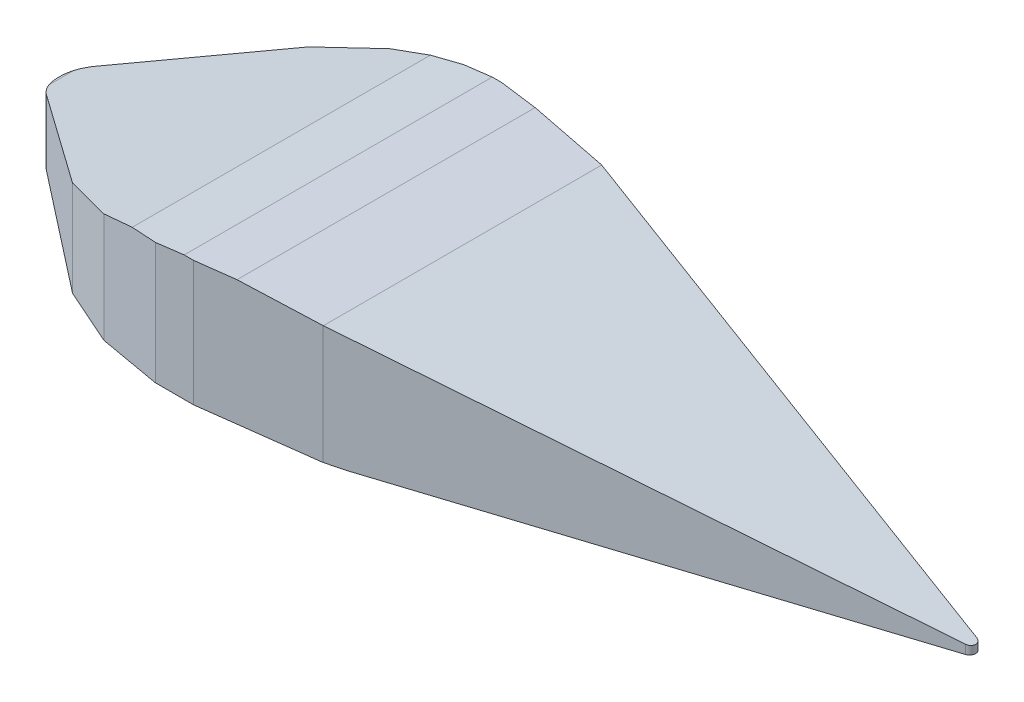
ISO-10303-21;
HEADER;
FILE_DESCRIPTION(('STEP AP214'),'2;1');
FILE_NAME('part.step','',(''),(''),'','','');
FILE_SCHEMA(('AUTOMOTIVE_DESIGN { 1 0 10303 214 1 1 1 1 }'));
ENDSEC;
DATA;
#1=APPLICATION_CONTEXT('core data for automotive mechanical design processes');
#2=APPLICATION_PROTOCOL_DEFINITION('international standard','automotive_design',2000,#1);
#3=PRODUCT_CONTEXT('',#1,'mechanical');
#4=PRODUCT('Part','Part','',(#3));
#5=PRODUCT_RELATED_PRODUCT_CATEGORY('part','',(#4));
#6=PRODUCT_DEFINITION_FORMATION('','',#4);
#7=PRODUCT_DEFINITION_CONTEXT('part definition',#1,'design');
#8=PRODUCT_DEFINITION('design','',#6,#7);
#9=PRODUCT_DEFINITION_SHAPE('','',#8);
#10=(LENGTH_UNIT() NAMED_UNIT(*) SI_UNIT(.MILLI.,.METRE.));
#11=(NAMED_UNIT(*) PLANE_ANGLE_UNIT() SI_UNIT($,.RADIAN.));
#12=(NAMED_UNIT(*) SI_UNIT($,.STERADIAN.) SOLID_ANGLE_UNIT());
#13=UNCERTAINTY_MEASURE_WITH_UNIT(LENGTH_MEASURE(1.E-05),#10,'distance_accuracy_value','');
#14=(GEOMETRIC_REPRESENTATION_CONTEXT(3) GLOBAL_UNCERTAINTY_ASSIGNED_CONTEXT((#13)) GLOBAL_UNIT_ASSIGNED_CONTEXT((#10,
#11,#12)) REPRESENTATION_CONTEXT('',''));
#15=CARTESIAN_POINT('',(0.,0.,0.));
#16=DIRECTION('',(0.,0.,1.));
#17=DIRECTION('',(1.,0.,0.));
#18=AXIS2_PLACEMENT_3D('',#15,#16,#17);
#19=CARTESIAN_POINT('',(1401.451,800.,-800.));
#20=DIRECTION('',(0.,0.,1.));
#21=DIRECTION('',(1.,0.,0.));
#22=AXIS2_PLACEMENT_3D('',#19,#20,#21);
#23=PLANE('',#22);
#24=DIRECTION('',(-0.992522376322293,-0.122062821938327,0.));
#25=VECTOR('',#24,1.);
#26=CARTESIAN_POINT('',(1255.921,763.655,-800.));
#27=LINE('',#26,#25);
#28=CARTESIAN_POINT('',(1551.451,800.,-800.));
#29=VERTEX_POINT('',#28);
#30=CARTESIAN_POINT('',(1401.451,781.55263425033,-800.));
#31=VERTEX_POINT('',#30);
#32=EDGE_CURVE('E472',#29,#31,#27,.T.);
#33=ORIENTED_EDGE('',*,*,#32,.F.);
#34=DIRECTION('',(-1.,0.,0.));
#35=VECTOR('',#34,1.);
#36=CARTESIAN_POINT('',(1401.451,800.,-800.));
#37=LINE('',#36,#35);
#38=CARTESIAN_POINT('',(1600.,800.,-800.));
#39=VERTEX_POINT('',#38);
#40=EDGE_CURVE('E220',#39,#29,#37,.T.);
#41=ORIENTED_EDGE('',*,*,#40,.F.);
#42=DIRECTION('',(0.,-1.,0.));
#43=VECTOR('',#42,1.);
#44=CARTESIAN_POINT('',(1600.,800.,-800.));
#45=LINE('',#44,#43);
#46=CARTESIAN_POINT('',(1600.,150.,-800.));
#47=VERTEX_POINT('',#46);
#48=EDGE_CURVE('E253',#39,#47,#45,.T.);
#49=ORIENTED_EDGE('',*,*,#48,.T.);
#50=DIRECTION('',(1.,0.,0.));
#51=VECTOR('',#50,1.);
#52=CARTESIAN_POINT('',(2301.451,150.,-800.));
#53=LINE('',#52,#51);
#54=CARTESIAN_POINT('',(1401.45099999999,150.,-800.));
#55=VERTEX_POINT('',#54);
#56=EDGE_CURVE('E474',#55,#47,#53,.T.);
#57=ORIENTED_EDGE('',*,*,#56,.F.);
#58=DIRECTION('',(0.,-1.,0.));
#59=VECTOR('',#58,1.);
#60=CARTESIAN_POINT('',(1401.451,800.,-800.));
#61=LINE('',#60,#59);
#62=EDGE_CURVE('E250',#31,#55,#61,.T.);
#63=ORIENTED_EDGE('',*,*,#62,.F.);
#64=EDGE_LOOP('',(#33,#41,#49,#57,#63));
#65=FACE_BOUND('',#64,.T.);
#66=ADVANCED_FACE('F46',(#65),#23,.F.);
#67=CARTESIAN_POINT('',(784.13,800.,-612.54));
#68=DIRECTION('',(0.406737992749078,0.,0.913544856728147));
#69=DIRECTION('',(0.913544856728147,0.,-0.406737992749078));
#70=AXIS2_PLACEMENT_3D('',#67,#68,#69);
#71=PLANE('',#70);
#72=DIRECTION('',(0.913544856728147,0.,-0.406737992749078));
#73=VECTOR('',#72,1.);
#74=CARTESIAN_POINT('',(784.13,150.,-612.54));
#75=LINE('',#74,#73);
#76=CARTESIAN_POINT('',(784.13,150.,-612.54));
#77=VERTEX_POINT('',#76);
#78=CARTESIAN_POINT('',(1076.464,150.,-742.696));
#79=VERTEX_POINT('',#78);
#80=EDGE_CURVE('E407',#77,#79,#75,.T.);
#81=ORIENTED_EDGE('',*,*,#80,.F.);
#82=DIRECTION('',(0.,-1.,0.));
#83=VECTOR('',#82,1.);
#84=CARTESIAN_POINT('',(784.13,800.,-612.54));
#85=LINE('',#84,#83);
#86=CARTESIAN_POINT('',(784.13,645.829431269961,-612.54));
#87=VERTEX_POINT('',#86);
#88=EDGE_CURVE('E295',#87,#77,#85,.T.);
#89=ORIENTED_EDGE('',*,*,#88,.F.);
#90=DIRECTION('',(-0.890658508940707,-0.222433970466134,0.396548293697233));
#91=VECTOR('',#90,1.);
#92=CARTESIAN_POINT('',(814.673148937951,653.457308644519,-626.138740116332));
#93=LINE('',#92,#91);
#94=CARTESIAN_POINT('',(1076.464,718.837224570654,-742.696));
#95=VERTEX_POINT('',#94);
#96=EDGE_CURVE('E504',#95,#87,#93,.T.);
#97=ORIENTED_EDGE('',*,*,#96,.F.);
#98=DIRECTION('',(0.,-1.,0.));
#99=VECTOR('',#98,1.);
#100=CARTESIAN_POINT('',(1076.464,800.,-742.696));
#101=LINE('',#100,#99);
#102=EDGE_CURVE('E242',#95,#79,#101,.T.);
#103=ORIENTED_EDGE('',*,*,#102,.T.);
#104=EDGE_LOOP('',(#81,#89,#97,#103));
#105=FACE_BOUND('',#104,.T.);
#106=ADVANCED_FACE('F48',(#105),#71,.F.);
#107=CARTESIAN_POINT('',(161.409759474516,800.,-126.088702215857));
#108=DIRECTION('',(0.615605620682322,0.,0.788054388849103));
#109=DIRECTION('',(0.788054388849103,0.,-0.615605620682322));
#110=AXIS2_PLACEMENT_3D('',#107,#108,#109);
#111=PLANE('',#110);
#112=DIRECTION('',(0.788054388849103,0.,-0.615605620682322));
#113=VECTOR('',#112,1.);
#114=CARTESIAN_POINT('',(161.409759474516,150.,-126.088702215857));
#115=LINE('',#114,#113);
#116=CARTESIAN_POINT('',(161.409759474516,150.,-126.088702215857));
#117=VERTEX_POINT('',#116);
#118=EDGE_CURVE('E411',#117,#77,#115,.T.);
#119=ORIENTED_EDGE('',*,*,#118,.F.);
#120=DIRECTION('',(0.,-1.,0.));
#121=VECTOR('',#120,1.);
#122=CARTESIAN_POINT('',(161.409759474516,800.,-126.088702215857));
#123=LINE('',#122,#121);
#124=CARTESIAN_POINT('',(161.409759474516,490.310639051325,-126.088702215857));
#125=VERTEX_POINT('',#124);
#126=EDGE_CURVE('E288',#125,#117,#123,.T.);
#127=ORIENTED_EDGE('',*,*,#126,.F.);
#128=DIRECTION('',(-0.773221678679863,-0.193105175903845,0.604018730387262));
#129=VECTOR('',#128,1.);
#130=CARTESIAN_POINT('',(207.650440557195,501.858834220438,-162.210603929074));
#131=LINE('',#130,#129);
#132=EDGE_CURVE('E508',#87,#125,#131,.T.);
#133=ORIENTED_EDGE('',*,*,#132,.F.);
#134=ORIENTED_EDGE('',*,*,#88,.T.);
#135=EDGE_LOOP('',(#119,#127,#133,#134));
#136=FACE_BOUND('',#135,.T.);
#137=ADVANCED_FACE('F378',(#136),#111,.F.);
#138=CARTESIAN_POINT('',(259.906658783687,800.,0.));
#139=DIRECTION('',(0.,-1.,0.));
#140=DIRECTION('',(0.,0.,-1.));
#141=AXIS2_PLACEMENT_3D('',#138,#139,#140);
#142=CYLINDRICAL_SURFACE('',#141,160.);
#143=CARTESIAN_POINT('',(259.906658783687,150.,0.));
#144=DIRECTION('',(0.,-1.,0.));
#145=DIRECTION('',(0.,0.,-1.));
#146=AXIS2_PLACEMENT_3D('',#143,#144,#145);
#147=CIRCLE('',#146,160.);
#148=CARTESIAN_POINT('',(150.000000000001,150.,-116.277798203296));
#149=VERTEX_POINT('',#148);
#150=EDGE_CURVE('E412',#149,#117,#147,.T.);
#151=ORIENTED_EDGE('',*,*,#150,.F.);
#152=CARTESIAN_POINT('',(150.000000000001,150.,116.277798203296));
#153=CARTESIAN_POINT('',(149.197227518989,150.000000444739,115.519013001235));
#154=CARTESIAN_POINT('',(148.402349323818,150.006444551494,114.751945115754));
#155=CARTESIAN_POINT('',(146.828761077163,150.031461689993,113.201629596887));
#156=CARTESIAN_POINT('',(146.050050642099,150.050034433644,112.418382348238));
#157=CARTESIAN_POINT('',(143.738992605804,150.122798834219,110.04521254094));
#158=CARTESIAN_POINT('',(142.231396084721,150.194037269926,108.43155736251));
#159=CARTESIAN_POINT('',(139.286546373213,150.375814699117,105.145862331909));
#160=CARTESIAN_POINT('',(137.849239225862,150.486322991144,103.473869007217));
#161=CARTESIAN_POINT('',(135.046053340974,150.740627964951,100.073395601841));
#162=CARTESIAN_POINT('',(133.680177219111,150.884425864692,98.3449134563995));
#163=CARTESIAN_POINT('',(131.02300306583,151.199252798717,94.8358771461096));
#164=CARTESIAN_POINT('',(129.731654200361,151.37026296545,93.0553597529596));
#165=CARTESIAN_POINT('',(127.224251842487,151.733785604688,89.4439038255724));
#166=CARTESIAN_POINT('',(126.008207640174,151.926300722009,87.6129591103741));
#167=CARTESIAN_POINT('',(123.653075843413,152.327163170553,83.9034496690219));
#168=CARTESIAN_POINT('',(122.514002675644,152.535513454298,82.0248761060327));
#169=CARTESIAN_POINT('',(120.314753352958,152.962451132073,78.2235331504458));
#170=CARTESIAN_POINT('',(119.254568306852,153.181037367909,76.3007687705009));
#171=CARTESIAN_POINT('',(117.216364660646,153.622684269366,72.4173979297616));
#172=CARTESIAN_POINT('',(116.238193444443,153.84573562226,70.4568704991597));
#173=CARTESIAN_POINT('',(114.363161419552,154.291577394139,66.4972847107506));
#174=CARTESIAN_POINT('',(113.466300511938,154.514367813441,64.498226399826));
#175=CARTESIAN_POINT('',(111.755279479412,154.954759642745,60.4646006807219));
#176=CARTESIAN_POINT('',(110.941114441265,155.172361360436,58.4300353905561));
#177=CARTESIAN_POINT('',(109.396721623775,155.597730716471,54.3282724139932));
#178=CARTESIAN_POINT('',(108.666493845212,155.805498354724,52.2610747272925));
#179=CARTESIAN_POINT('',(107.291517437633,156.206751675774,48.0980446572107));
#180=CARTESIAN_POINT('',(106.646732773703,156.400243363975,46.002224759014));
#181=CARTESIAN_POINT('',(105.443470641596,156.769026649784,41.7843631491049));
#182=CARTESIAN_POINT('',(104.884993033116,156.944318276979,39.6623214800256));
#183=CARTESIAN_POINT('',(103.855447732851,157.273084547455,35.3954250788465));
#184=CARTESIAN_POINT('',(103.384381074604,157.426558932767,33.2505700773214));
#185=CARTESIAN_POINT('',(102.530668116976,157.708522147084,28.9416891731521));
#186=CARTESIAN_POINT('',(102.148022100941,157.837010896023,26.7776632090972));
#187=CARTESIAN_POINT('',(101.465667462758,158.068499170636,22.3934355301932));
#188=CARTESIAN_POINT('',(101.16765188495,158.170974528566,20.1729421971747));
#189=CARTESIAN_POINT('',(100.665032437988,158.345025688777,15.7201891996206));
#190=CARTESIAN_POINT('',(100.460428869546,158.416601391587,13.4879294972302));
#191=CARTESIAN_POINT('',(100.145158117363,158.527307591483,9.01595322708889));
#192=CARTESIAN_POINT('',(100.034491923749,158.566437746585,6.77623658098936));
#193=CARTESIAN_POINT('',(99.9073913706491,158.611403854638,2.29379848782876));
#194=CARTESIAN_POINT('',(99.8909568527162,158.617239863573,0.051077045826518));
#195=CARTESIAN_POINT('',(99.9523649444746,158.595490600866,-4.43306367901725));
#196=CARTESIAN_POINT('',(100.030213962676,158.567903057404,-6.67448286298269));
#197=CARTESIAN_POINT('',(100.279994263522,158.479900598214,-11.1514286514722));
#198=CARTESIAN_POINT('',(100.451925825091,158.419485585162,-13.3869552385069));
#199=CARTESIAN_POINT('',(100.889419452544,158.267136953808,-17.8476868417839));
#200=CARTESIAN_POINT('',(101.154979400206,158.175204048558,-20.0728920903795));
#201=CARTESIAN_POINT('',(101.779063595891,157.961800844771,-24.5087784389172));
#202=CARTESIAN_POINT('',(102.137587017684,157.840330808752,-26.7194596677651));
#203=CARTESIAN_POINT('',(102.926775780276,157.577123600622,-31.013612685877));
#204=CARTESIAN_POINT('',(103.353010132429,157.436681731273,-33.0979803235239));
#205=CARTESIAN_POINT('',(104.287844992139,157.134188084224,-37.2465553021804));
#206=CARTESIAN_POINT('',(104.796444743854,156.972136504832,-39.3107628280092));
#207=CARTESIAN_POINT('',(105.895018848793,156.629565097021,-43.4157709760834));
#208=CARTESIAN_POINT('',(106.484990458811,156.449045891235,-45.456572384884));
#209=CARTESIAN_POINT('',(107.745269602171,156.073038938233,-49.5118169088476));
#210=CARTESIAN_POINT('',(108.415577358716,155.87755114943,-51.5262599507603));
#211=CARTESIAN_POINT('',(109.835448832084,155.475423435206,-55.5259909350782));
#212=CARTESIAN_POINT('',(110.585016389714,155.268782969582,-57.5112774592898));
#213=CARTESIAN_POINT('',(112.162222998921,154.848463183412,-61.449830452093));
#214=CARTESIAN_POINT('',(112.989862077778,154.634783860406,-63.4030969094954));
#215=CARTESIAN_POINT('',(114.722056314859,154.204722154663,-67.2750290342799));
#216=CARTESIAN_POINT('',(115.626615162842,153.988339642681,-69.1936930364624));
#217=CARTESIAN_POINT('',(117.511377819577,153.557438268491,-72.9937124329083));
#218=CARTESIAN_POINT('',(118.491581457163,153.342919402067,-74.8750679115794));
#219=CARTESIAN_POINT('',(120.50777368734,152.924342060301,-78.5639102097275));
#220=CARTESIAN_POINT('',(121.542417530248,152.72016412512,-80.3721185349167));
#221=CARTESIAN_POINT('',(123.6821993027,152.32279256364,-83.9478298250324));
#222=CARTESIAN_POINT('',(124.787344283253,152.129600039688,-85.71532869436));
#223=CARTESIAN_POINT('',(127.066448812287,151.759031112758,-89.2066346063972));
#224=CARTESIAN_POINT('',(128.240395586125,151.581651789015,-90.9304496754102));
#225=CARTESIAN_POINT('',(130.655656175891,151.247580067016,-94.3320138856592));
#226=CARTESIAN_POINT('',(131.896962496125,151.090885373631,-96.0097681213313));
#227=CARTESIAN_POINT('',(134.446592080054,150.803019950715,-99.3183641400929));
#228=CARTESIAN_POINT('',(135.754977031147,150.671873267667,-100.949160506855));
#229=CARTESIAN_POINT('',(138.435759352656,150.44038541193,-104.159463428637));
#230=CARTESIAN_POINT('',(139.808154676331,150.340043255038,-105.73897162087));
#231=CARTESIAN_POINT('',(142.615869629207,150.1752575045,-108.845099188879));
#232=CARTESIAN_POINT('',(144.051233647807,150.110839688822,-110.371679851087));
#233=CARTESIAN_POINT('',(146.981580403563,150.023207631752,-113.368082399426));
#234=CARTESIAN_POINT('',(148.476570551278,149.999998528351,-114.83789718552));
#235=CARTESIAN_POINT('',(150.000000000001,150.,-116.277798203296));
#236=B_SPLINE_CURVE_WITH_KNOTS('',3,(#152,#153,#154,#155,#156,#157,#158,#159,#160,#161,#162,
#163,#164,#165,#166,#167,#168,#169,#170,#171,#172,#173,#174,#175,#176,#177,#178,#179,#180,#181,
#182,#183,#184,#185,#186,#187,#188,#189,#190,#191,#192,#193,#194,#195,#196,#197,#198,#199,#200,
#201,#202,#203,#204,#205,#206,#207,#208,#209,#210,#211,#212,#213,#214,#215,#216,#217,#218,#219,
#220,#221,#222,#223,#224,#225,#226,#227,#228,#229,#230,#231,#232,#233,#234,#235),.UNSPECIFIED.,
.F.,.F.,(4,2,2,2,2,2,2,2,2,2,2,2,2,2,2,2,2,2,2,2,2,2,2,2,2,2,2,2,2,2,2,2,2,2,2,2,2,2,2,2,2,4),
(0.,3.31371001652173,6.6273413252177,13.2532751900696,19.8740402078592,26.4950474965281,
33.1114839710404,39.728735074476,46.347223028574,52.9649639039096,59.5701033647876,
66.1752347893619,72.7799735513202,79.3847123747203,85.9866567792445,92.588590451293,
99.190602178882,105.792635062469,112.518689760156,119.244766110194,125.970913354142,
132.697049288266,139.42364242767,146.150255509359,152.876716419738,159.603117549501,
165.997719115792,172.392262004003,178.786589372256,185.180934506686,191.575589643311,
197.970247014478,204.3652113037,210.76016112315,217.038388778441,223.317245323713,
229.59493972496,235.871936978217,242.154814065332,248.437490393973,254.724669155171,
261.012631760362),.UNSPECIFIED.);
#237=CARTESIAN_POINT('',(150.000000000001,150.,116.277798203296));
#238=VERTEX_POINT('',#237);
#239=EDGE_CURVE('E12',#238,#149,#236,.T.);
#240=ORIENTED_EDGE('',*,*,#239,.F.);
#241=CARTESIAN_POINT('',(161.409759474516,150.,126.088702215857));
#242=VERTEX_POINT('',#241);
#243=EDGE_CURVE('E389',#242,#238,#147,.T.);
#244=ORIENTED_EDGE('',*,*,#243,.F.);
#245=DIRECTION('',(0.,-1.,0.));
#246=VECTOR('',#245,1.);
#247=CARTESIAN_POINT('',(161.409759474516,800.,126.088702215857));
#248=LINE('',#247,#246);
#249=CARTESIAN_POINT('',(161.409759474516,490.310639051325,126.088702215857));
#250=VERTEX_POINT('',#249);
#251=EDGE_CURVE('E283',#250,#242,#248,.T.);
#252=ORIENTED_EDGE('',*,*,#251,.F.);
#253=CARTESIAN_POINT('',(259.906658783687,514.909355812027,0.));
#254=DIRECTION('',(-0.242299141310606,0.970201590454346,0.));
#255=DIRECTION('',(-0.970201590454346,-0.242299141310606,0.));
#256=AXIS2_PLACEMENT_3D('',#253,#254,#255);
#257=ELLIPSE('',#256,164.914180283988,160.);
#258=CARTESIAN_POINT('',(113.655128803409,478.384348557619,64.8882884535251));
#259=VERTEX_POINT('',#258);
#260=EDGE_CURVE('E405',#259,#250,#257,.T.);
#261=ORIENTED_EDGE('',*,*,#260,.F.);
#262=CARTESIAN_POINT('',(113.655128803409,478.384348557619,-64.8882884535262));
#263=CARTESIAN_POINT('',(112.773939032918,478.164232994411,-62.9022135519064));
#264=CARTESIAN_POINT('',(111.933155729284,477.945795953747,-60.8980057661391));
#265=CARTESIAN_POINT('',(110.333625202496,477.516710712539,-56.8562236105315));
#266=CARTESIAN_POINT('',(109.574880662755,477.306062766917,-54.8186481517732));
#267=CARTESIAN_POINT('',(108.140474526136,476.896935722458,-50.7124900371555));
#268=CARTESIAN_POINT('',(107.464840130629,476.698460618308,-48.6438974768202));
#269=CARTESIAN_POINT('',(106.198137658814,476.317814583301,-44.4795123289952));
#270=CARTESIAN_POINT('',(105.607068680471,476.135643478542,-42.3837200318979));
#271=CARTESIAN_POINT('',(104.511164120193,475.791492586405,-38.170326894472));
#272=CARTESIAN_POINT('',(104.006242210099,475.629492630005,-36.0527501682851));
#273=CARTESIAN_POINT('',(103.082932209994,475.328755377082,-31.7971598743901));
#274=CARTESIAN_POINT('',(102.66454431668,475.190018133439,-29.6591462602389));
#275=CARTESIAN_POINT('',(101.915268820844,474.938644041753,-25.3666448290491));
#276=CARTESIAN_POINT('',(101.58436782491,474.826003198927,-23.2121595856825));
#277=CARTESIAN_POINT('',(101.010740244002,474.629088177567,-18.8901866979925));
#278=CARTESIAN_POINT('',(100.768013552683,474.544813964819,-16.7226990693543));
#279=CARTESIAN_POINT('',(100.37076423608,474.406161867699,-12.3726224328995));
#280=CARTESIAN_POINT('',(100.21648827366,474.351867603903,-10.1900082088244));
#281=CARTESIAN_POINT('',(99.9975671230744,474.274653761924,-5.8197269539753));
#282=CARTESIAN_POINT('',(99.9329221235671,474.251734249778,-3.63205991257581));
#283=CARTESIAN_POINT('',(99.8934242819723,474.237742403755,0.744450738233989));
#284=CARTESIAN_POINT('',(99.9185822486836,474.246673903504,2.93329445756778));
#285=CARTESIAN_POINT('',(100.05865020922,474.296207977458,7.30773390133306));
#286=CARTESIAN_POINT('',(100.173559683034,474.336810368165,9.49332964450948));
#287=CARTESIAN_POINT('',(100.492693380218,474.448796061191,13.8551440212281));
#288=CARTESIAN_POINT('',(100.696834271621,474.520150643601,16.0313694952312));
#289=CARTESIAN_POINT('',(101.193919943739,474.692171407193,20.3725274347643));
#290=CARTESIAN_POINT('',(101.486866629951,474.792838217324,22.5374596569623));
#291=CARTESIAN_POINT('',(102.16078590948,475.021392150112,26.8515295793954));
#292=CARTESIAN_POINT('',(102.541734866669,475.149271963028,29.0006713610749));
#293=CARTESIAN_POINT('',(103.390811659426,475.429645345374,33.2798357862657));
#294=CARTESIAN_POINT('',(103.8589325439,475.582136952128,35.4098599400322));
#295=CARTESIAN_POINT('',(104.936939869616,475.926381416005,39.8776210107061));
#296=CARTESIAN_POINT('',(105.556701493798,476.120599632764,42.2127912998076));
#297=CARTESIAN_POINT('',(106.900536974426,476.5305848942,46.8503359801782));
#298=CARTESIAN_POINT('',(107.624586121608,476.746346830732,49.1527179985066));
#299=CARTESIAN_POINT('',(109.174416422244,477.193713901137,53.7177097487012));
#300=CARTESIAN_POINT('',(110.000046911566,477.425295350108,55.980372828677));
#301=CARTESIAN_POINT('',(111.314153213711,477.78033591011,59.3440574899914));
#302=CARTESIAN_POINT('',(111.764862264654,477.899976882307,60.4603772225235));
#303=CARTESIAN_POINT('',(112.691287391965,478.141029180627,62.6823991134768));
#304=CARTESIAN_POINT('',(113.167003475439,478.262440507252,63.7881012688804));
#305=CARTESIAN_POINT('',(113.655128803409,478.384348557619,64.8882884535262));
#306=B_SPLINE_CURVE_WITH_KNOTS('',3,(#262,#263,#264,#265,#266,#267,#268,#269,#270,#271,#272,
#273,#274,#275,#276,#277,#278,#279,#280,#281,#282,#283,#284,#285,#286,#287,#288,#289,#290,#291,
#292,#293,#294,#295,#296,#297,#298,#299,#300,#301,#302,#303,#304,#305),.UNSPECIFIED.,.F.,.F.,(4,
2,2,2,2,2,2,2,2,2,2,2,2,2,2,2,2,2,2,2,2,4),(0.,6.55129299468969,13.1028002115111,
19.6564460177392,26.2100219127685,32.7569913826109,39.3039757340479,45.849957223369,
52.395930817664,58.9600714939325,65.5242259865693,72.0891705757979,78.654077128723,
85.2128658627704,91.7717953380147,98.3289652243588,104.885612465355,112.154383970393,
119.421436080517,126.677836867381,130.306981102657,133.936126369311),.UNSPECIFIED.);
#307=CARTESIAN_POINT('',(113.655128803409,478.384348557619,-64.8882884535256));
#308=VERTEX_POINT('',#307);
#309=EDGE_CURVE('E61',#308,#259,#306,.T.);
#310=ORIENTED_EDGE('',*,*,#309,.F.);
#311=EDGE_CURVE('E404',#125,#308,#257,.T.);
#312=ORIENTED_EDGE('',*,*,#311,.F.);
#313=ORIENTED_EDGE('',*,*,#126,.T.);
#314=EDGE_LOOP('',(#151,#240,#244,#252,#261,#310,#312,#313));
#315=FACE_BOUND('',#314,.T.);
#316=ADVANCED_FACE('F320',(#315),#142,.T.);
#317=CARTESIAN_POINT('',(784.13,800.,612.54));
#318=DIRECTION('',(0.615605620682322,0.,-0.788054388849103));
#319=DIRECTION('',(-0.788054388849103,0.,-0.615605620682322));
#320=AXIS2_PLACEMENT_3D('',#317,#318,#319);
#321=PLANE('',#320);
#322=DIRECTION('',(-0.788054388849103,0.,-0.615605620682322));
#323=VECTOR('',#322,1.);
#324=CARTESIAN_POINT('',(784.13,150.,612.54));
#325=LINE('',#324,#323);
#326=CARTESIAN_POINT('',(784.13,150.,612.54));
#327=VERTEX_POINT('',#326);
#328=EDGE_CURVE('E385',#327,#242,#325,.T.);
#329=ORIENTED_EDGE('',*,*,#328,.F.);
#330=DIRECTION('',(0.,-1.,0.));
#331=VECTOR('',#330,1.);
#332=CARTESIAN_POINT('',(784.13,800.,612.54));
#333=LINE('',#332,#331);
#334=CARTESIAN_POINT('',(784.13,645.82943126996,612.54));
#335=VERTEX_POINT('',#334);
#336=EDGE_CURVE('E278',#335,#327,#333,.T.);
#337=ORIENTED_EDGE('',*,*,#336,.F.);
#338=DIRECTION('',(0.773221678679863,0.193105175903845,0.604018730387262));
#339=VECTOR('',#338,1.);
#340=CARTESIAN_POINT('',(807.149686821474,651.578391491176,630.522323040345));
#341=LINE('',#340,#339);
#342=EDGE_CURVE('E400',#250,#335,#341,.T.);
#343=ORIENTED_EDGE('',*,*,#342,.F.);
#344=ORIENTED_EDGE('',*,*,#251,.T.);
#345=EDGE_LOOP('',(#329,#337,#343,#344));
#346=FACE_BOUND('',#345,.T.);
#347=ADVANCED_FACE('F371',(#346),#321,.F.);
#348=CARTESIAN_POINT('',(1076.464,800.,742.696));
#349=DIRECTION('',(0.406737992749078,0.,-0.913544856728147));
#350=DIRECTION('',(-0.913544856728147,0.,-0.406737992749078));
#351=AXIS2_PLACEMENT_3D('',#348,#349,#350);
#352=PLANE('',#351);
#353=DIRECTION('',(-0.913544856728147,0.,-0.406737992749078));
#354=VECTOR('',#353,1.);
#355=CARTESIAN_POINT('',(1076.464,150.,742.696));
#356=LINE('',#355,#354);
#357=CARTESIAN_POINT('',(1076.464,150.,742.696));
#358=VERTEX_POINT('',#357);
#359=EDGE_CURVE('E386',#358,#327,#356,.T.);
#360=ORIENTED_EDGE('',*,*,#359,.F.);
#361=DIRECTION('',(0.,-1.,0.));
#362=VECTOR('',#361,1.);
#363=CARTESIAN_POINT('',(1076.464,800.,742.696));
#364=LINE('',#363,#362);
#365=CARTESIAN_POINT('',(1076.464,718.837224570654,742.696));
#366=VERTEX_POINT('',#365);
#367=EDGE_CURVE('E277',#366,#358,#364,.T.);
#368=ORIENTED_EDGE('',*,*,#367,.F.);
#369=DIRECTION('',(0.890658508940707,0.222433970466134,0.396548293697233));
#370=VECTOR('',#369,1.);
#371=CARTESIAN_POINT('',(1092.5433772675,722.852904758212,749.85502846617));
#372=LINE('',#371,#370);
#373=EDGE_CURVE('E393',#335,#366,#372,.T.);
#374=ORIENTED_EDGE('',*,*,#373,.F.);
#375=ORIENTED_EDGE('',*,*,#336,.T.);
#376=EDGE_LOOP('',(#360,#368,#374,#375));
#377=FACE_BOUND('',#376,.T.);
#378=ADVANCED_FACE('F366',(#377),#352,.F.);
#379=CARTESIAN_POINT('',(1401.451,800.,800.));
#380=DIRECTION('',(0.173648246791891,0.,-0.98480774082361));
#381=DIRECTION('',(-0.98480774082361,0.,-0.173648246791891));
#382=AXIS2_PLACEMENT_3D('',#379,#380,#381);
#383=PLANE('',#382);
#384=DIRECTION('',(-0.98480774082361,0.,-0.173648246791891));
#385=VECTOR('',#384,1.);
#386=CARTESIAN_POINT('',(1401.451,150.,800.));
#387=LINE('',#386,#385);
#388=CARTESIAN_POINT('',(1401.451,150.,800.));
#389=VERTEX_POINT('',#388);
#390=EDGE_CURVE('E427',#389,#358,#387,.T.);
#391=ORIENTED_EDGE('',*,*,#390,.F.);
#392=DIRECTION('',(0.,-1.,0.));
#393=VECTOR('',#392,1.);
#394=CARTESIAN_POINT('',(1401.451,800.,800.));
#395=LINE('',#394,#393);
#396=CARTESIAN_POINT('',(1401.451,781.55263425033,800.));
#397=VERTEX_POINT('',#396);
#398=EDGE_CURVE('E272',#397,#389,#395,.T.);
#399=ORIENTED_EDGE('',*,*,#398,.F.);
#400=DIRECTION('',(0.977663361324776,0.120235424042734,0.172388499408761));
#401=VECTOR('',#400,1.);
#402=CARTESIAN_POINT('',(1403.61948357921,781.819319648382,800.382362319179));
#403=LINE('',#402,#401);
#404=CARTESIAN_POINT('',(1255.921,763.655,774.339123964959));
#405=VERTEX_POINT('',#404);
#406=EDGE_CURVE('E203',#405,#397,#403,.T.);
#407=ORIENTED_EDGE('',*,*,#406,.F.);
#408=DIRECTION('',(0.956308883695465,0.238829562460936,0.168623127298276));
#409=VECTOR('',#408,1.);
#410=CARTESIAN_POINT('',(1401.45104302586,799.999822361657,800.000007586622));
#411=LINE('',#410,#409);
#412=EDGE_CURVE('E398',#366,#405,#411,.T.);
#413=ORIENTED_EDGE('',*,*,#412,.F.);
#414=ORIENTED_EDGE('',*,*,#367,.T.);
#415=EDGE_LOOP('',(#391,#399,#407,#413,#414));
#416=FACE_BOUND('',#415,.T.);
#417=ADVANCED_FACE('F362',(#416),#383,.F.);
#418=CARTESIAN_POINT('',(2195.064,800.,723.196));
#419=DIRECTION('',(-0.128006663375473,0.,-0.99177330783374));
#420=DIRECTION('',(-0.99177330783374,0.,0.128006663375473));
#421=AXIS2_PLACEMENT_3D('',#418,#419,#420);
#422=PLANE('',#421);
#423=DIRECTION('',(0.988176358868169,-0.0850906413949235,-0.127542410676013));
#424=VECTOR('',#423,1.);
#425=CARTESIAN_POINT('',(2192.20357179836,766.227836577747,723.565191091376));
#426=LINE('',#425,#424);
#427=CARTESIAN_POINT('',(1800.,800.,774.186306010782));
#428=VERTEX_POINT('',#427);
#429=CARTESIAN_POINT('',(2195.064,765.98152865087,723.196));
#430=VERTEX_POINT('',#429);
#431=EDGE_CURVE('E463',#428,#430,#426,.T.);
#432=ORIENTED_EDGE('',*,*,#431,.F.);
#433=DIRECTION('',(0.99177330783374,0.,-0.128006663375473));
#434=VECTOR('',#433,1.);
#435=CARTESIAN_POINT('',(2195.064,800.,723.196));
#436=LINE('',#435,#434);
#437=CARTESIAN_POINT('',(1600.,800.,800.));
#438=VERTEX_POINT('',#437);
#439=EDGE_CURVE('E227',#438,#428,#436,.T.);
#440=ORIENTED_EDGE('',*,*,#439,.F.);
#441=DIRECTION('',(0.,-1.,0.));
#442=VECTOR('',#441,1.);
#443=CARTESIAN_POINT('',(1600.,800.,800.));
#444=LINE('',#443,#442);
#445=CARTESIAN_POINT('',(1600.,150.,800.));
#446=VERTEX_POINT('',#445);
#447=EDGE_CURVE('E223',#438,#446,#444,.T.);
#448=ORIENTED_EDGE('',*,*,#447,.T.);
#449=DIRECTION('',(-0.99177330783374,0.,0.128006663375473));
#450=VECTOR('',#449,1.);
#451=CARTESIAN_POINT('',(2195.064,150.,723.196));
#452=LINE('',#451,#450);
#453=CARTESIAN_POINT('',(2195.064,150.,723.196));
#454=VERTEX_POINT('',#453);
#455=EDGE_CURVE('E426',#454,#446,#452,.T.);
#456=ORIENTED_EDGE('',*,*,#455,.F.);
#457=DIRECTION('',(0.,-1.,0.));
#458=VECTOR('',#457,1.);
#459=CARTESIAN_POINT('',(2195.064,800.,723.196));
#460=LINE('',#459,#458);
#461=EDGE_CURVE('E270',#430,#454,#460,.T.);
#462=ORIENTED_EDGE('',*,*,#461,.F.);
#463=EDGE_LOOP('',(#432,#440,#448,#456,#462));
#464=FACE_BOUND('',#463,.T.);
#465=ADVANCED_FACE('F358',(#464),#422,.F.);
#466=CARTESIAN_POINT('',(4839.46343464737,800.,29.0168635194273));
#467=DIRECTION('',(-0.253906438356408,0.,-0.967228783980897));
#468=DIRECTION('',(-0.967228783980897,0.,0.253906438356408));
#469=AXIS2_PLACEMENT_3D('',#466,#467,#468);
#470=PLANE('',#469);
#471=DIRECTION('',(0.963891447163198,-0.0829994977497124,-0.253030356793274));
#472=VECTOR('',#471,1.);
#473=CARTESIAN_POINT('',(4818.52482445617,540.078568896688,34.5134409846886));
#474=LINE('',#473,#472);
#475=CARTESIAN_POINT('',(2197.056,765.81,722.673081706435));
#476=VERTEX_POINT('',#475);
#477=EDGE_CURVE('E498',#430,#476,#474,.T.);
#478=ORIENTED_EDGE('',*,*,#477,.F.);
#479=ORIENTED_EDGE('',*,*,#461,.T.);
#480=DIRECTION('',(-0.967228783980897,0.,0.253906438356408));
#481=VECTOR('',#480,1.);
#482=CARTESIAN_POINT('',(4839.46343464737,150.,29.0168635194273));
#483=LINE('',#482,#481);
#484=CARTESIAN_POINT('',(2301.451,150.,695.268435493238));
#485=VERTEX_POINT('',#484);
#486=EDGE_CURVE('E421',#485,#454,#483,.T.);
#487=ORIENTED_EDGE('',*,*,#486,.F.);
#488=DIRECTION('',(-0.966367468305207,-0.0421924613438821,0.253680335081633));
#489=VECTOR('',#488,1.);
#490=CARTESIAN_POINT('',(4861.44797961414,261.771740197603,23.2457185702208));
#491=LINE('',#490,#489);
#492=CARTESIAN_POINT('',(4839.46343464737,260.811875452466,29.0168635194273));
#493=VERTEX_POINT('',#492);
#494=EDGE_CURVE('E438',#493,#485,#491,.T.);
#495=ORIENTED_EDGE('',*,*,#494,.F.);
#496=DIRECTION('',(0.,-1.,0.));
#497=VECTOR('',#496,1.);
#498=CARTESIAN_POINT('',(4839.46343464737,800.,29.0168635194273));
#499=LINE('',#498,#497);
#500=CARTESIAN_POINT('',(4839.46343464737,307.343464130711,29.0168635194273));
#501=VERTEX_POINT('',#500);
#502=EDGE_CURVE('E263',#501,#493,#499,.T.);
#503=ORIENTED_EDGE('',*,*,#502,.F.);
#504=DIRECTION('',(0.953889991686832,-0.165503106884578,-0.250404882882198));
#505=VECTOR('',#504,1.);
#506=CARTESIAN_POINT('',(4761.68688160886,320.837956454595,49.4339229542903));
#507=LINE('',#506,#505);
#508=EDGE_CURVE('E228',#476,#501,#507,.T.);
#509=ORIENTED_EDGE('',*,*,#508,.F.);
#510=EDGE_LOOP('',(#478,#479,#487,#495,#503,#509));
#511=FACE_BOUND('',#510,.T.);
#512=ADVANCED_FACE('F353',(#511),#470,.F.);
#513=CARTESIAN_POINT('',(4831.84624149668,800.,0.));
#514=DIRECTION('',(0.,-1.,0.));
#515=DIRECTION('',(0.,0.,-1.));
#516=AXIS2_PLACEMENT_3D('',#513,#514,#515);
#517=CYLINDRICAL_SURFACE('',#516,30.);
#518=CARTESIAN_POINT('',(4831.84624149668,308.665072642348,0.));
#519=DIRECTION('',(0.170949346923816,0.985279818521785,0.));
#520=DIRECTION('',(0.985279818521785,-0.170949346923816,0.));
#521=AXIS2_PLACEMENT_3D('',#518,#519,#520);
#522=ELLIPSE('',#521,30.4482030749488,30.);
#523=CARTESIAN_POINT('',(4839.46343464737,307.343464130711,-29.0168635194276));
#524=VERTEX_POINT('',#523);
#525=EDGE_CURVE('E234',#501,#524,#522,.T.);
#526=ORIENTED_EDGE('',*,*,#525,.F.);
#527=ORIENTED_EDGE('',*,*,#502,.T.);
#528=CARTESIAN_POINT('',(4831.84624149668,260.479302039039,0.));
#529=DIRECTION('',(0.0436193321422773,-0.999048223992947,0.));
#530=DIRECTION('',(-0.999048223992947,-0.0436193321422773,0.));
#531=AXIS2_PLACEMENT_3D('',#528,#529,#530);
#532=ELLIPSE('',#531,30.028580482429,30.);
#533=CARTESIAN_POINT('',(4839.46343464737,260.811875452466,-29.0168635194274));
#534=VERTEX_POINT('',#533);
#535=EDGE_CURVE('E436',#534,#493,#532,.T.);
#536=ORIENTED_EDGE('',*,*,#535,.F.);
#537=DIRECTION('',(0.,-1.,0.));
#538=VECTOR('',#537,1.);
#539=CARTESIAN_POINT('',(4839.46343464737,800.,-29.0168635194273));
#540=LINE('',#539,#538);
#541=EDGE_CURVE('E259',#524,#534,#540,.T.);
#542=ORIENTED_EDGE('',*,*,#541,.F.);
#543=EDGE_LOOP('',(#526,#527,#536,#542));
#544=FACE_BOUND('',#543,.T.);
#545=ADVANCED_FACE('F348',(#544),#517,.T.);
#546=CARTESIAN_POINT('',(2195.064,800.,-723.196));
#547=DIRECTION('',(-0.253906438356408,0.,0.967228783980897));
#548=DIRECTION('',(0.967228783980897,0.,0.253906438356408));
#549=AXIS2_PLACEMENT_3D('',#546,#547,#548);
#550=PLANE('',#549);
#551=DIRECTION('',(-0.963891447163198,0.0829994977497124,-0.253030356793274));
#552=VECTOR('',#551,1.);
#553=CARTESIAN_POINT('',(2192.34243704179,766.215879063762,-723.910435270049));
#554=LINE('',#553,#552);
#555=CARTESIAN_POINT('',(2197.056,765.81,-722.673081706435));
#556=VERTEX_POINT('',#555);
#557=CARTESIAN_POINT('',(2195.064,765.98152865087,-723.196));
#558=VERTEX_POINT('',#557);
#559=EDGE_CURVE('E68',#556,#558,#554,.T.);
#560=ORIENTED_EDGE('',*,*,#559,.F.);
#561=DIRECTION('',(-0.953889991686832,0.165503106884578,-0.250404882882198));
#562=VECTOR('',#561,1.);
#563=CARTESIAN_POINT('',(2189.72092804616,767.082659539529,-724.598605456071));
#564=LINE('',#563,#562);
#565=EDGE_CURVE('E310',#524,#556,#564,.T.);
#566=ORIENTED_EDGE('',*,*,#565,.F.);
#567=ORIENTED_EDGE('',*,*,#541,.T.);
#568=DIRECTION('',(0.966367468305207,0.0421924613438821,0.253680335081633));
#569=VECTOR('',#568,1.);
#570=CARTESIAN_POINT('',(2221.75611487385,146.520450583993,-716.189074718138));
#571=LINE('',#570,#569);
#572=CARTESIAN_POINT('',(2301.451,150.,-695.268435493238));
#573=VERTEX_POINT('',#572);
#574=EDGE_CURVE('E308',#573,#534,#571,.T.);
#575=ORIENTED_EDGE('',*,*,#574,.F.);
#576=DIRECTION('',(0.967228783980897,0.,0.253906438356408));
#577=VECTOR('',#576,1.);
#578=CARTESIAN_POINT('',(2195.064,150.,-723.196));
#579=LINE('',#578,#577);
#580=CARTESIAN_POINT('',(2195.064,150.,-723.196));
#581=VERTEX_POINT('',#580);
#582=EDGE_CURVE('E419',#581,#573,#579,.T.);
#583=ORIENTED_EDGE('',*,*,#582,.F.);
#584=DIRECTION('',(0.,-1.,0.));
#585=VECTOR('',#584,1.);
#586=CARTESIAN_POINT('',(2195.064,800.,-723.196));
#587=LINE('',#586,#585);
#588=EDGE_CURVE('E254',#558,#581,#587,.T.);
#589=ORIENTED_EDGE('',*,*,#588,.F.);
#590=EDGE_LOOP('',(#560,#566,#567,#575,#583,#589));
#591=FACE_BOUND('',#590,.T.);
#592=ADVANCED_FACE('F347',(#591),#550,.F.);
#593=CARTESIAN_POINT('',(1600.,800.,-800.));
#594=DIRECTION('',(-0.128006663375473,0.,0.99177330783374));
#595=DIRECTION('',(0.99177330783374,0.,0.128006663375473));
#596=AXIS2_PLACEMENT_3D('',#593,#594,#595);
#597=PLANE('',#596);
#598=DIRECTION('',(-0.988176358868169,0.0850906413949235,-0.127542410676013));
#599=VECTOR('',#598,1.);
#600=CARTESIAN_POINT('',(1601.4480834506,817.097059424424,-799.813098084677));
#601=LINE('',#600,#599);
#602=CARTESIAN_POINT('',(1800.,800.,-774.186306010782));
#603=VERTEX_POINT('',#602);
#604=EDGE_CURVE('E218',#558,#603,#601,.T.);
#605=ORIENTED_EDGE('',*,*,#604,.F.);
#606=ORIENTED_EDGE('',*,*,#588,.T.);
#607=DIRECTION('',(0.99177330783374,0.,0.128006663375473));
#608=VECTOR('',#607,1.);
#609=CARTESIAN_POINT('',(1600.,150.,-800.));
#610=LINE('',#609,#608);
#611=EDGE_CURVE('E417',#47,#581,#610,.T.);
#612=ORIENTED_EDGE('',*,*,#611,.F.);
#613=ORIENTED_EDGE('',*,*,#48,.F.);
#614=DIRECTION('',(-0.99177330783374,0.,-0.128006663375473));
#615=VECTOR('',#614,1.);
#616=CARTESIAN_POINT('',(1600.,800.,-800.));
#617=LINE('',#616,#615);
#618=EDGE_CURVE('E233',#603,#39,#617,.T.);
#619=ORIENTED_EDGE('',*,*,#618,.F.);
#620=EDGE_LOOP('',(#605,#606,#612,#613,#619));
#621=FACE_BOUND('',#620,.T.);
#622=ADVANCED_FACE('F338',(#621),#597,.F.);
#623=CARTESIAN_POINT('',(1076.464,800.,-742.696));
#624=DIRECTION('',(0.173648246791891,0.,0.98480774082361));
#625=DIRECTION('',(0.98480774082361,0.,-0.173648246791891));
#626=AXIS2_PLACEMENT_3D('',#623,#624,#625);
#627=PLANE('',#626);
#628=DIRECTION('',(0.98480774082361,0.,-0.173648246791891));
#629=VECTOR('',#628,1.);
#630=CARTESIAN_POINT('',(1076.464,150.,-742.696));
#631=LINE('',#630,#629);
#632=EDGE_CURVE('E303',#79,#55,#631,.T.);
#633=ORIENTED_EDGE('',*,*,#632,.F.);
#634=ORIENTED_EDGE('',*,*,#102,.F.);
#635=DIRECTION('',(-0.956308883695465,-0.238829562460936,0.168623127298276));
#636=VECTOR('',#635,1.);
#637=CARTESIAN_POINT('',(1095.00115848079,723.466713561835,-745.964602527435));
#638=LINE('',#637,#636);
#639=CARTESIAN_POINT('',(1255.921,763.655,-774.339123964959));
#640=VERTEX_POINT('',#639);
#641=EDGE_CURVE('E300',#640,#95,#638,.T.);
#642=ORIENTED_EDGE('',*,*,#641,.F.);
#643=DIRECTION('',(-0.977663361324776,-0.120235424042734,0.172388499408761));
#644=VECTOR('',#643,1.);
#645=CARTESIAN_POINT('',(1083.33067673226,742.429421212174,-743.906780872666));
#646=LINE('',#645,#644);
#647=EDGE_CURVE('E299',#31,#640,#646,.T.);
#648=ORIENTED_EDGE('',*,*,#647,.F.);
#649=ORIENTED_EDGE('',*,*,#62,.T.);
#650=EDGE_LOOP('',(#633,#634,#642,#648,#649));
#651=FACE_BOUND('',#650,.T.);
#652=ADVANCED_FACE('F336',(#651),#627,.F.);
#653=CARTESIAN_POINT('',(4831.84624149668,800.,0.));
#654=DIRECTION('',(0.,-1.,0.));
#655=DIRECTION('',(0.,0.,-1.));
#656=AXIS2_PLACEMENT_3D('',#653,#654,#655);
#657=PLANE('',#656);
#658=DIRECTION('',(0.,0.,1.));
#659=VECTOR('',#658,1.);
#660=CARTESIAN_POINT('',(1800.,800.,-800.));
#661=LINE('',#660,#659);
#662=EDGE_CURVE('E296',#603,#428,#661,.T.);
#663=ORIENTED_EDGE('',*,*,#662,.F.);
#664=ORIENTED_EDGE('',*,*,#618,.T.);
#665=ORIENTED_EDGE('',*,*,#40,.T.);
#666=DIRECTION('',(0.,0.,1.));
#667=VECTOR('',#666,1.);
#668=CARTESIAN_POINT('',(1551.451,800.,-800.));
#669=LINE('',#668,#667);
#670=CARTESIAN_POINT('',(1551.451,800.,800.));
#671=VERTEX_POINT('',#670);
#672=EDGE_CURVE('E196',#29,#671,#669,.T.);
#673=ORIENTED_EDGE('',*,*,#672,.T.);
#674=DIRECTION('',(1.,0.,0.));
#675=VECTOR('',#674,1.);
#676=CARTESIAN_POINT('',(1600.,800.,800.));
#677=LINE('',#676,#675);
#678=EDGE_CURVE('E212',#671,#438,#677,.T.);
#679=ORIENTED_EDGE('',*,*,#678,.T.);
#680=ORIENTED_EDGE('',*,*,#439,.T.);
#681=EDGE_LOOP('',(#663,#664,#665,#673,#679,#680));
#682=FACE_BOUND('',#681,.T.);
#683=ADVANCED_FACE('F215',(#682),#657,.F.);
#684=CARTESIAN_POINT('',(1600.,800.,800.));
#685=DIRECTION('',(0.,0.,-1.));
#686=DIRECTION('',(-1.,0.,0.));
#687=AXIS2_PLACEMENT_3D('',#684,#685,#686);
#688=PLANE('',#687);
#689=ORIENTED_EDGE('',*,*,#678,.F.);
#690=DIRECTION('',(-0.992522376322293,-0.122062821938327,0.));
#691=VECTOR('',#690,1.);
#692=CARTESIAN_POINT('',(1255.921,763.655,800.));
#693=LINE('',#692,#691);
#694=EDGE_CURVE('E194',#671,#397,#693,.T.);
#695=ORIENTED_EDGE('',*,*,#694,.T.);
#696=ORIENTED_EDGE('',*,*,#398,.T.);
#697=DIRECTION('',(1.,0.,0.));
#698=VECTOR('',#697,1.);
#699=CARTESIAN_POINT('',(2301.451,150.,800.));
#700=LINE('',#699,#698);
#701=EDGE_CURVE('E210',#389,#446,#700,.T.);
#702=ORIENTED_EDGE('',*,*,#701,.T.);
#703=ORIENTED_EDGE('',*,*,#447,.F.);
#704=EDGE_LOOP('',(#689,#695,#696,#702,#703));
#705=FACE_BOUND('',#704,.T.);
#706=ADVANCED_FACE('F225',(#705),#688,.F.);
#707=CARTESIAN_POINT('',(113.655128803409,478.384348557619,-800.));
#708=DIRECTION('',(-0.242299141310606,0.970201590454346,0.));
#709=DIRECTION('',(-0.970201590454346,-0.242299141310606,0.));
#710=AXIS2_PLACEMENT_3D('',#707,#708,#709);
#711=PLANE('',#710);
#712=ORIENTED_EDGE('',*,*,#260,.T.);
#713=ORIENTED_EDGE('',*,*,#342,.T.);
#714=ORIENTED_EDGE('',*,*,#373,.T.);
#715=ORIENTED_EDGE('',*,*,#412,.T.);
#716=DIRECTION('',(0.,0.,1.));
#717=VECTOR('',#716,1.);
#718=CARTESIAN_POINT('',(1255.921,763.655,-800.));
#719=LINE('',#718,#717);
#720=EDGE_CURVE('E76',#640,#405,#719,.T.);
#721=ORIENTED_EDGE('',*,*,#720,.F.);
#722=ORIENTED_EDGE('',*,*,#641,.T.);
#723=ORIENTED_EDGE('',*,*,#96,.T.);
#724=ORIENTED_EDGE('',*,*,#132,.T.);
#725=ORIENTED_EDGE('',*,*,#311,.T.);
#726=DIRECTION('',(0.,0.,1.));
#727=VECTOR('',#726,1.);
#728=CARTESIAN_POINT('',(113.655128803409,478.384348557619,-800.));
#729=LINE('',#728,#727);
#730=EDGE_CURVE('E489',#308,#259,#729,.T.);
#731=ORIENTED_EDGE('',*,*,#730,.T.);
#732=EDGE_LOOP('',(#712,#713,#714,#715,#721,#722,#723,#724,#725,#731));
#733=FACE_BOUND('',#732,.T.);
#734=ADVANCED_FACE('F328',(#733),#711,.T.);
#735=CARTESIAN_POINT('',(1255.921,763.655,-800.));
#736=DIRECTION('',(-0.122062821938327,0.992522376322293,0.));
#737=DIRECTION('',(-0.992522376322293,-0.122062821938327,0.));
#738=AXIS2_PLACEMENT_3D('',#735,#736,#737);
#739=PLANE('',#738);
#740=ORIENTED_EDGE('',*,*,#406,.T.);
#741=ORIENTED_EDGE('',*,*,#694,.F.);
#742=ORIENTED_EDGE('',*,*,#672,.F.);
#743=ORIENTED_EDGE('',*,*,#32,.T.);
#744=ORIENTED_EDGE('',*,*,#647,.T.);
#745=ORIENTED_EDGE('',*,*,#720,.T.);
#746=EDGE_LOOP('',(#740,#741,#742,#743,#744,#745));
#747=FACE_BOUND('',#746,.T.);
#748=ADVANCED_FACE('F197',(#747),#739,.T.);
#749=CARTESIAN_POINT('',(150.,332.854109989467,-800.));
#750=DIRECTION('',(0.,0.,1.));
#751=DIRECTION('',(1.,0.,0.));
#752=AXIS2_PLACEMENT_3D('',#749,#750,#751);
#753=CYLINDRICAL_SURFACE('',#752,150.);
#754=ORIENTED_EDGE('',*,*,#309,.T.);
#755=ORIENTED_EDGE('',*,*,#730,.F.);
#756=EDGE_LOOP('',(#754,#755));
#757=FACE_BOUND('',#756,.T.);
#758=ADVANCED_FACE('F319',(#757),#753,.T.);
#759=CARTESIAN_POINT('',(2301.451,150.,-800.));
#760=DIRECTION('',(0.,-1.,0.));
#761=DIRECTION('',(0.,0.,-1.));
#762=AXIS2_PLACEMENT_3D('',#759,#760,#761);
#763=PLANE('',#762);
#764=ORIENTED_EDGE('',*,*,#243,.T.);
#765=DIRECTION('',(0.,0.,1.));
#766=VECTOR('',#765,1.);
#767=CARTESIAN_POINT('',(150.000000000001,150.,-800.));
#768=LINE('',#767,#766);
#769=EDGE_CURVE('E486',#149,#238,#768,.T.);
#770=ORIENTED_EDGE('',*,*,#769,.F.);
#771=ORIENTED_EDGE('',*,*,#150,.T.);
#772=ORIENTED_EDGE('',*,*,#118,.T.);
#773=ORIENTED_EDGE('',*,*,#80,.T.);
#774=ORIENTED_EDGE('',*,*,#632,.T.);
#775=ORIENTED_EDGE('',*,*,#56,.T.);
#776=ORIENTED_EDGE('',*,*,#611,.T.);
#777=ORIENTED_EDGE('',*,*,#582,.T.);
#778=DIRECTION('',(0.,0.,1.));
#779=VECTOR('',#778,1.);
#780=CARTESIAN_POINT('',(2301.451,150.,-800.));
#781=LINE('',#780,#779);
#782=EDGE_CURVE('E465',#573,#485,#781,.T.);
#783=ORIENTED_EDGE('',*,*,#782,.T.);
#784=ORIENTED_EDGE('',*,*,#486,.T.);
#785=ORIENTED_EDGE('',*,*,#455,.T.);
#786=ORIENTED_EDGE('',*,*,#701,.F.);
#787=ORIENTED_EDGE('',*,*,#390,.T.);
#788=ORIENTED_EDGE('',*,*,#359,.T.);
#789=ORIENTED_EDGE('',*,*,#328,.T.);
#790=EDGE_LOOP('',(#764,#770,#771,#772,#773,#774,#775,#776,#777,#783,#784,#785,#786,#787,#788,#789));
#791=FACE_BOUND('',#790,.T.);
#792=ADVANCED_FACE('F322',(#791),#763,.T.);
#793=CARTESIAN_POINT('',(4950.,265.638,-800.));
#794=DIRECTION('',(0.0436193321422773,-0.999048223992947,0.));
#795=DIRECTION('',(0.999048223992947,0.0436193321422773,0.));
#796=AXIS2_PLACEMENT_3D('',#793,#794,#795);
#797=PLANE('',#796);
#798=ORIENTED_EDGE('',*,*,#494,.T.);
#799=ORIENTED_EDGE('',*,*,#782,.F.);
#800=ORIENTED_EDGE('',*,*,#574,.T.);
#801=ORIENTED_EDGE('',*,*,#535,.T.);
#802=EDGE_LOOP('',(#798,#799,#800,#801));
#803=FACE_BOUND('',#802,.T.);
#804=ADVANCED_FACE('F454',(#803),#797,.T.);
#805=CARTESIAN_POINT('',(150.,300.,-800.));
#806=DIRECTION('',(0.,0.,1.));
#807=DIRECTION('',(1.,0.,0.));
#808=AXIS2_PLACEMENT_3D('',#805,#806,#807);
#809=CYLINDRICAL_SURFACE('',#808,150.);
#810=ORIENTED_EDGE('',*,*,#239,.T.);
#811=ORIENTED_EDGE('',*,*,#769,.T.);
#812=EDGE_LOOP('',(#810,#811));
#813=FACE_BOUND('',#812,.T.);
#814=ADVANCED_FACE('F326',(#813),#809,.T.);
#815=CARTESIAN_POINT('',(2197.056,765.81,-800.));
#816=DIRECTION('',(0.170949346923816,0.985279818521785,0.));
#817=DIRECTION('',(-0.985279818521785,0.170949346923816,0.));
#818=AXIS2_PLACEMENT_3D('',#815,#816,#817);
#819=PLANE('',#818);
#820=ORIENTED_EDGE('',*,*,#508,.T.);
#821=ORIENTED_EDGE('',*,*,#525,.T.);
#822=ORIENTED_EDGE('',*,*,#565,.T.);
#823=DIRECTION('',(0.,0.,1.));
#824=VECTOR('',#823,1.);
#825=CARTESIAN_POINT('',(2197.056,765.81,-800.));
#826=LINE('',#825,#824);
#827=EDGE_CURVE('E219',#556,#476,#826,.T.);
#828=ORIENTED_EDGE('',*,*,#827,.T.);
#829=EDGE_LOOP('',(#820,#821,#822,#828));
#830=FACE_BOUND('',#829,.T.);
#831=ADVANCED_FACE('F443',(#830),#819,.T.);
#832=CARTESIAN_POINT('',(1800.,800.,-800.));
#833=DIRECTION('',(0.0857912887476274,0.996313130885577,0.));
#834=DIRECTION('',(-0.996313130885577,0.0857912887476274,0.));
#835=AXIS2_PLACEMENT_3D('',#832,#833,#834);
#836=PLANE('',#835);
#837=ORIENTED_EDGE('',*,*,#431,.T.);
#838=ORIENTED_EDGE('',*,*,#477,.T.);
#839=ORIENTED_EDGE('',*,*,#827,.F.);
#840=ORIENTED_EDGE('',*,*,#559,.T.);
#841=ORIENTED_EDGE('',*,*,#604,.T.);
#842=ORIENTED_EDGE('',*,*,#662,.T.);
#843=EDGE_LOOP('',(#837,#838,#839,#840,#841,#842));
#844=FACE_BOUND('',#843,.T.);
#845=ADVANCED_FACE('F528',(#844),#836,.T.);
#846=CLOSED_SHELL('',(#66,#106,#137,#316,#347,#378,#417,#465,#512,#545,#592,#622,#652,#683,#706,
#734,#748,#758,#792,#804,#814,#831,#845));
#847=MANIFOLD_SOLID_BREP('B2',#846);
#848=ADVANCED_BREP_SHAPE_REPRESENTATION('',(#18,#847),#14);
#849=SHAPE_DEFINITION_REPRESENTATION(#9,#848);
ENDSEC;
END-ISO-10303-21;
